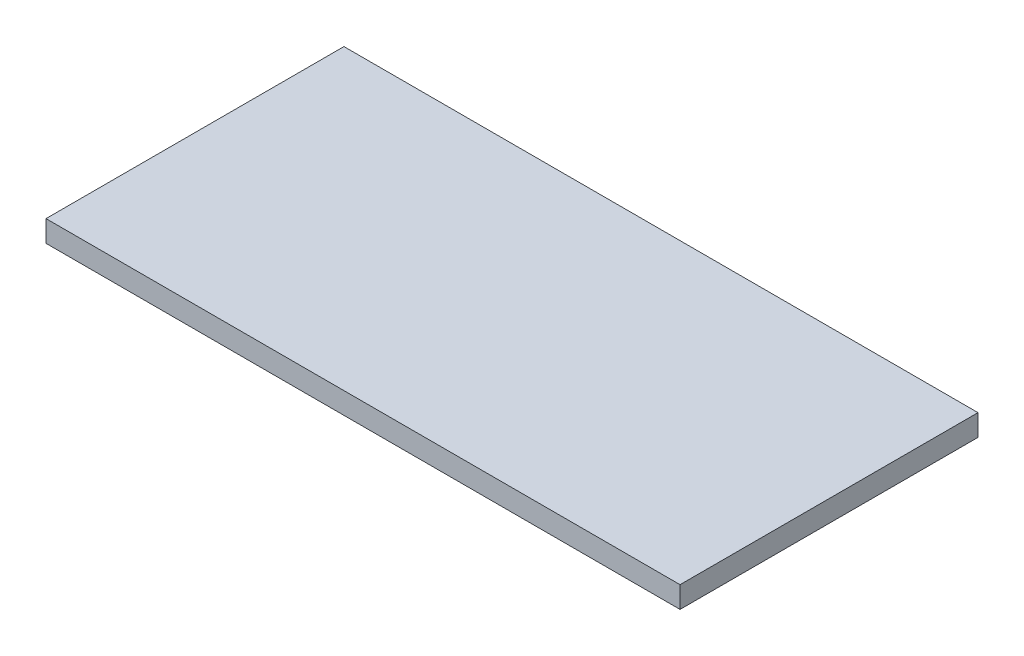
ISO-10303-21;
HEADER;
FILE_DESCRIPTION(('STEP AP214'),'2;1');
FILE_NAME('part.step','',(''),(''),'','','');
FILE_SCHEMA(('AUTOMOTIVE_DESIGN { 1 0 10303 214 1 1 1 1 }'));
ENDSEC;
DATA;
#1=APPLICATION_CONTEXT('core data for automotive mechanical design processes');
#2=APPLICATION_PROTOCOL_DEFINITION('international standard','automotive_design',2000,#1);
#3=PRODUCT_CONTEXT('',#1,'mechanical');
#4=PRODUCT('Part','Part','',(#3));
#5=PRODUCT_RELATED_PRODUCT_CATEGORY('part','',(#4));
#6=PRODUCT_DEFINITION_FORMATION('','',#4);
#7=PRODUCT_DEFINITION_CONTEXT('part definition',#1,'design');
#8=PRODUCT_DEFINITION('design','',#6,#7);
#9=PRODUCT_DEFINITION_SHAPE('','',#8);
#10=(LENGTH_UNIT() NAMED_UNIT(*) SI_UNIT(.MILLI.,.METRE.));
#11=(NAMED_UNIT(*) PLANE_ANGLE_UNIT() SI_UNIT($,.RADIAN.));
#12=(NAMED_UNIT(*) SI_UNIT($,.STERADIAN.) SOLID_ANGLE_UNIT());
#13=UNCERTAINTY_MEASURE_WITH_UNIT(LENGTH_MEASURE(1.E-05),#10,'distance_accuracy_value','');
#14=(GEOMETRIC_REPRESENTATION_CONTEXT(3) GLOBAL_UNCERTAINTY_ASSIGNED_CONTEXT((#13)) GLOBAL_UNIT_ASSIGNED_CONTEXT((#10,
#11,#12)) REPRESENTATION_CONTEXT('',''));
#15=CARTESIAN_POINT('',(0.,0.,0.));
#16=DIRECTION('',(0.,0.,1.));
#17=DIRECTION('',(1.,0.,0.));
#18=AXIS2_PLACEMENT_3D('',#15,#16,#17);
#19=CARTESIAN_POINT('',(266.,18.,-125.));
#20=DIRECTION('',(-1.,0.,0.));
#21=DIRECTION('',(0.,0.,1.));
#22=AXIS2_PLACEMENT_3D('',#19,#20,#21);
#23=PLANE('',#22);
#24=DIRECTION('',(0.,0.,-1.));
#25=VECTOR('',#24,1.);
#26=CARTESIAN_POINT('',(266.,0.,-125.));
#27=LINE('',#26,#25);
#28=CARTESIAN_POINT('',(266.,0.,125.));
#29=VERTEX_POINT('',#28);
#30=CARTESIAN_POINT('',(266.,0.,-125.));
#31=VERTEX_POINT('',#30);
#32=EDGE_CURVE('E107',#29,#31,#27,.T.);
#33=ORIENTED_EDGE('',*,*,#32,.T.);
#34=DIRECTION('',(0.,-1.,0.));
#35=VECTOR('',#34,1.);
#36=CARTESIAN_POINT('',(266.,18.,-125.));
#37=LINE('',#36,#35);
#38=CARTESIAN_POINT('',(266.,18.,-125.));
#39=VERTEX_POINT('',#38);
#40=EDGE_CURVE('E11',#39,#31,#37,.T.);
#41=ORIENTED_EDGE('',*,*,#40,.F.);
#42=DIRECTION('',(0.,0.,-1.));
#43=VECTOR('',#42,1.);
#44=CARTESIAN_POINT('',(266.,18.,-125.));
#45=LINE('',#44,#43);
#46=CARTESIAN_POINT('',(266.,18.,125.));
#47=VERTEX_POINT('',#46);
#48=EDGE_CURVE('E91',#47,#39,#45,.T.);
#49=ORIENTED_EDGE('',*,*,#48,.F.);
#50=DIRECTION('',(0.,-1.,0.));
#51=VECTOR('',#50,1.);
#52=CARTESIAN_POINT('',(266.,18.,125.));
#53=LINE('',#52,#51);
#54=EDGE_CURVE('E103',#47,#29,#53,.T.);
#55=ORIENTED_EDGE('',*,*,#54,.T.);
#56=EDGE_LOOP('',(#33,#41,#49,#55));
#57=FACE_BOUND('',#56,.T.);
#58=ADVANCED_FACE('F39',(#57),#23,.F.);
#59=CARTESIAN_POINT('',(-266.,18.,-125.));
#60=DIRECTION('',(0.,0.,1.));
#61=DIRECTION('',(1.,0.,0.));
#62=AXIS2_PLACEMENT_3D('',#59,#60,#61);
#63=PLANE('',#62);
#64=DIRECTION('',(-1.,0.,0.));
#65=VECTOR('',#64,1.);
#66=CARTESIAN_POINT('',(-266.,0.,-125.));
#67=LINE('',#66,#65);
#68=CARTESIAN_POINT('',(-266.,0.,-125.));
#69=VERTEX_POINT('',#68);
#70=EDGE_CURVE('E96',#31,#69,#67,.T.);
#71=ORIENTED_EDGE('',*,*,#70,.T.);
#72=DIRECTION('',(0.,-1.,0.));
#73=VECTOR('',#72,1.);
#74=CARTESIAN_POINT('',(-266.,18.,-125.));
#75=LINE('',#74,#73);
#76=CARTESIAN_POINT('',(-266.,18.,-125.));
#77=VERTEX_POINT('',#76);
#78=EDGE_CURVE('E48',#77,#69,#75,.T.);
#79=ORIENTED_EDGE('',*,*,#78,.F.);
#80=DIRECTION('',(-1.,0.,0.));
#81=VECTOR('',#80,1.);
#82=CARTESIAN_POINT('',(-266.,18.,-125.));
#83=LINE('',#82,#81);
#84=EDGE_CURVE('E86',#39,#77,#83,.T.);
#85=ORIENTED_EDGE('',*,*,#84,.F.);
#86=ORIENTED_EDGE('',*,*,#40,.T.);
#87=EDGE_LOOP('',(#71,#79,#85,#86));
#88=FACE_BOUND('',#87,.T.);
#89=ADVANCED_FACE('F95',(#88),#63,.F.);
#90=CARTESIAN_POINT('',(-266.,18.,-125.));
#91=DIRECTION('',(1.,0.,0.));
#92=DIRECTION('',(0.,0.,-1.));
#93=AXIS2_PLACEMENT_3D('',#90,#91,#92);
#94=PLANE('',#93);
#95=DIRECTION('',(0.,0.,1.));
#96=VECTOR('',#95,1.);
#97=CARTESIAN_POINT('',(-266.,0.,-125.));
#98=LINE('',#97,#96);
#99=CARTESIAN_POINT('',(-266.,0.,125.));
#100=VERTEX_POINT('',#99);
#101=EDGE_CURVE('E73',#69,#100,#98,.T.);
#102=ORIENTED_EDGE('',*,*,#101,.T.);
#103=DIRECTION('',(0.,-1.,0.));
#104=VECTOR('',#103,1.);
#105=CARTESIAN_POINT('',(-266.,18.,125.));
#106=LINE('',#105,#104);
#107=CARTESIAN_POINT('',(-266.,18.,125.));
#108=VERTEX_POINT('',#107);
#109=EDGE_CURVE('E98',#108,#100,#106,.T.);
#110=ORIENTED_EDGE('',*,*,#109,.F.);
#111=DIRECTION('',(0.,0.,1.));
#112=VECTOR('',#111,1.);
#113=CARTESIAN_POINT('',(-266.,18.,-125.));
#114=LINE('',#113,#112);
#115=EDGE_CURVE('E89',#77,#108,#114,.T.);
#116=ORIENTED_EDGE('',*,*,#115,.F.);
#117=ORIENTED_EDGE('',*,*,#78,.T.);
#118=EDGE_LOOP('',(#102,#110,#116,#117));
#119=FACE_BOUND('',#118,.T.);
#120=ADVANCED_FACE('F99',(#119),#94,.F.);
#121=CARTESIAN_POINT('',(-266.,18.,125.));
#122=DIRECTION('',(0.,0.,-1.));
#123=DIRECTION('',(-1.,0.,0.));
#124=AXIS2_PLACEMENT_3D('',#121,#122,#123);
#125=PLANE('',#124);
#126=DIRECTION('',(1.,0.,0.));
#127=VECTOR('',#126,1.);
#128=CARTESIAN_POINT('',(-266.,0.,125.));
#129=LINE('',#128,#127);
#130=EDGE_CURVE('E79',#100,#29,#129,.T.);
#131=ORIENTED_EDGE('',*,*,#130,.T.);
#132=ORIENTED_EDGE('',*,*,#54,.F.);
#133=DIRECTION('',(1.,0.,0.));
#134=VECTOR('',#133,1.);
#135=CARTESIAN_POINT('',(-266.,18.,125.));
#136=LINE('',#135,#134);
#137=EDGE_CURVE('E56',#108,#47,#136,.T.);
#138=ORIENTED_EDGE('',*,*,#137,.F.);
#139=ORIENTED_EDGE('',*,*,#109,.T.);
#140=EDGE_LOOP('',(#131,#132,#138,#139));
#141=FACE_BOUND('',#140,.T.);
#142=ADVANCED_FACE('F120',(#141),#125,.F.);
#143=CARTESIAN_POINT('',(0.,18.,0.));
#144=DIRECTION('',(0.,1.,0.));
#145=DIRECTION('',(0.,0.,1.));
#146=AXIS2_PLACEMENT_3D('',#143,#144,#145);
#147=PLANE('',#146);
#148=ORIENTED_EDGE('',*,*,#48,.T.);
#149=ORIENTED_EDGE('',*,*,#84,.T.);
#150=ORIENTED_EDGE('',*,*,#115,.T.);
#151=ORIENTED_EDGE('',*,*,#137,.T.);
#152=EDGE_LOOP('',(#148,#149,#150,#151));
#153=FACE_BOUND('',#152,.T.);
#154=ADVANCED_FACE('F87',(#153),#147,.T.);
#155=CARTESIAN_POINT('',(0.,0.,0.));
#156=DIRECTION('',(0.,1.,0.));
#157=DIRECTION('',(0.,0.,1.));
#158=AXIS2_PLACEMENT_3D('',#155,#156,#157);
#159=PLANE('',#158);
#160=ORIENTED_EDGE('',*,*,#32,.F.);
#161=ORIENTED_EDGE('',*,*,#130,.F.);
#162=ORIENTED_EDGE('',*,*,#101,.F.);
#163=ORIENTED_EDGE('',*,*,#70,.F.);
#164=EDGE_LOOP('',(#160,#161,#162,#163));
#165=FACE_BOUND('',#164,.T.);
#166=ADVANCED_FACE('F123',(#165),#159,.F.);
#167=CLOSED_SHELL('',(#58,#89,#120,#142,#154,#166));
#168=MANIFOLD_SOLID_BREP('B2',#167);
#169=ADVANCED_BREP_SHAPE_REPRESENTATION('',(#18,#168),#14);
#170=SHAPE_DEFINITION_REPRESENTATION(#9,#169);
ENDSEC;
END-ISO-10303-21;
